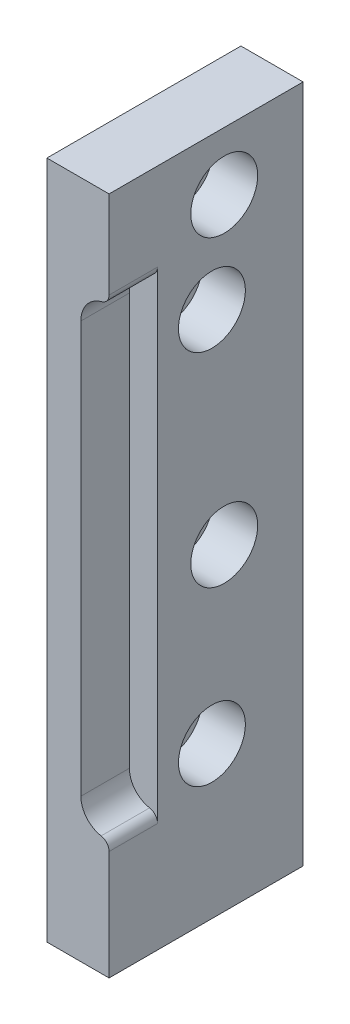
ISO-10303-21;
HEADER;
FILE_DESCRIPTION(('STEP AP214'),'2;1');
FILE_NAME('part.step','',(''),(''),'','','');
FILE_SCHEMA(('AUTOMOTIVE_DESIGN { 1 0 10303 214 1 1 1 1 }'));
ENDSEC;
DATA;
#1=APPLICATION_CONTEXT('core data for automotive mechanical design processes');
#2=APPLICATION_PROTOCOL_DEFINITION('international standard','automotive_design',2000,#1);
#3=PRODUCT_CONTEXT('',#1,'mechanical');
#4=PRODUCT('Part','Part','',(#3));
#5=PRODUCT_RELATED_PRODUCT_CATEGORY('part','',(#4));
#6=PRODUCT_DEFINITION_FORMATION('','',#4);
#7=PRODUCT_DEFINITION_CONTEXT('part definition',#1,'design');
#8=PRODUCT_DEFINITION('design','',#6,#7);
#9=PRODUCT_DEFINITION_SHAPE('','',#8);
#10=(LENGTH_UNIT() NAMED_UNIT(*) SI_UNIT(.MILLI.,.METRE.));
#11=(NAMED_UNIT(*) PLANE_ANGLE_UNIT() SI_UNIT($,.RADIAN.));
#12=(NAMED_UNIT(*) SI_UNIT($,.STERADIAN.) SOLID_ANGLE_UNIT());
#13=UNCERTAINTY_MEASURE_WITH_UNIT(LENGTH_MEASURE(1.E-05),#10,'distance_accuracy_value','');
#14=(GEOMETRIC_REPRESENTATION_CONTEXT(3) GLOBAL_UNCERTAINTY_ASSIGNED_CONTEXT((#13)) GLOBAL_UNIT_ASSIGNED_CONTEXT((#10,
#11,#12)) REPRESENTATION_CONTEXT('',''));
#15=CARTESIAN_POINT('',(0.,0.,0.));
#16=DIRECTION('',(0.,0.,1.));
#17=DIRECTION('',(1.,0.,0.));
#18=AXIS2_PLACEMENT_3D('',#15,#16,#17);
#19=CARTESIAN_POINT('',(-8.1407,73.66,-4.7498));
#20=DIRECTION('',(1.,0.,0.));
#21=DIRECTION('',(0.,0.,-1.));
#22=AXIS2_PLACEMENT_3D('',#19,#20,#21);
#23=CYLINDRICAL_SURFACE('',#22,5.715);
#24=CARTESIAN_POINT('',(-8.1407,73.66,-4.7498));
#25=DIRECTION('',(1.,0.,0.));
#26=DIRECTION('',(0.,0.,-1.));
#27=AXIS2_PLACEMENT_3D('',#24,#25,#26);
#28=CIRCLE('',#27,5.715);
#29=CARTESIAN_POINT('',(-8.1407,73.66,-10.4648));
#30=VERTEX_POINT('',#29);
#31=EDGE_CURVE('E183',#30,#30,#28,.T.);
#32=ORIENTED_EDGE('',*,*,#31,.F.);
#33=EDGE_LOOP('',(#32));
#34=FACE_BOUND('',#33,.T.);
#35=CARTESIAN_POINT('',(-3.5433,73.66,-4.7498));
#36=DIRECTION('',(1.,0.,0.));
#37=DIRECTION('',(0.,0.,-1.));
#38=AXIS2_PLACEMENT_3D('',#35,#36,#37);
#39=CIRCLE('',#38,5.715);
#40=CARTESIAN_POINT('',(-3.5433,73.66,-10.4648));
#41=VERTEX_POINT('',#40);
#42=EDGE_CURVE('E278',#41,#41,#39,.F.);
#43=ORIENTED_EDGE('',*,*,#42,.F.);
#44=EDGE_LOOP('',(#43));
#45=FACE_BOUND('',#44,.T.);
#46=ADVANCED_FACE('F50',(#34,#45),#23,.F.);
#47=CARTESIAN_POINT('',(-8.1407,-5.71500000000003,-4.7498));
#48=DIRECTION('',(1.,0.,0.));
#49=DIRECTION('',(0.,0.,-1.));
#50=AXIS2_PLACEMENT_3D('',#47,#48,#49);
#51=CYLINDRICAL_SURFACE('',#50,5.715);
#52=CARTESIAN_POINT('',(-8.1407,-5.71500000000003,-4.7498));
#53=DIRECTION('',(1.,0.,0.));
#54=DIRECTION('',(0.,0.,-1.));
#55=AXIS2_PLACEMENT_3D('',#52,#53,#54);
#56=CIRCLE('',#55,5.715);
#57=CARTESIAN_POINT('',(-8.1407,-5.71500000000003,-10.4648));
#58=VERTEX_POINT('',#57);
#59=EDGE_CURVE('E333',#58,#58,#56,.T.);
#60=ORIENTED_EDGE('',*,*,#59,.F.);
#61=EDGE_LOOP('',(#60));
#62=FACE_BOUND('',#61,.T.);
#63=CARTESIAN_POINT('',(-3.5433,-5.71500000000003,-4.7498));
#64=DIRECTION('',(1.,0.,0.));
#65=DIRECTION('',(0.,0.,-1.));
#66=AXIS2_PLACEMENT_3D('',#63,#64,#65);
#67=CIRCLE('',#66,5.715);
#68=CARTESIAN_POINT('',(-3.5433,-5.71500000000003,-10.4648));
#69=VERTEX_POINT('',#68);
#70=EDGE_CURVE('E274',#69,#69,#67,.F.);
#71=ORIENTED_EDGE('',*,*,#70,.F.);
#72=EDGE_LOOP('',(#71));
#73=FACE_BOUND('',#72,.T.);
#74=ADVANCED_FACE('F385',(#62,#73),#51,.F.);
#75=CARTESIAN_POINT('',(-8.1407,-49.211738,-1.524));
#76=DIRECTION('',(1.,0.,0.));
#77=DIRECTION('',(0.,0.,-1.));
#78=AXIS2_PLACEMENT_3D('',#75,#76,#77);
#79=CYLINDRICAL_SURFACE('',#78,6.75767);
#80=CARTESIAN_POINT('',(-8.1407,-49.211738,-1.524));
#81=DIRECTION('',(1.,0.,0.));
#82=DIRECTION('',(0.,0.,-1.));
#83=AXIS2_PLACEMENT_3D('',#80,#81,#82);
#84=CIRCLE('',#83,6.75767);
#85=CARTESIAN_POINT('',(-8.1407,-49.211738,-8.28167));
#86=VERTEX_POINT('',#85);
#87=EDGE_CURVE('E220',#86,#86,#84,.T.);
#88=ORIENTED_EDGE('',*,*,#87,.F.);
#89=EDGE_LOOP('',(#88));
#90=FACE_BOUND('',#89,.T.);
#91=CARTESIAN_POINT('',(-3.1877,-49.211738,-1.524));
#92=DIRECTION('',(1.,0.,0.));
#93=DIRECTION('',(0.,0.,-1.));
#94=AXIS2_PLACEMENT_3D('',#91,#92,#93);
#95=CIRCLE('',#94,6.75767);
#96=CARTESIAN_POINT('',(-3.1877,-49.211738,-8.28167));
#97=VERTEX_POINT('',#96);
#98=EDGE_CURVE('E224',#97,#97,#95,.F.);
#99=ORIENTED_EDGE('',*,*,#98,.F.);
#100=EDGE_LOOP('',(#99));
#101=FACE_BOUND('',#100,.T.);
#102=ADVANCED_FACE('F391',(#90,#101),#79,.F.);
#103=CARTESIAN_POINT('',(-8.1407,49.211738,-1.524));
#104=DIRECTION('',(1.,0.,0.));
#105=DIRECTION('',(0.,0.,-1.));
#106=AXIS2_PLACEMENT_3D('',#103,#104,#105);
#107=CYLINDRICAL_SURFACE('',#106,6.75767);
#108=CARTESIAN_POINT('',(-8.1407,49.211738,-1.524));
#109=DIRECTION('',(1.,0.,0.));
#110=DIRECTION('',(0.,0.,-1.));
#111=AXIS2_PLACEMENT_3D('',#108,#109,#110);
#112=CIRCLE('',#111,6.75767);
#113=CARTESIAN_POINT('',(-8.1407,49.211738,-8.28167));
#114=VERTEX_POINT('',#113);
#115=EDGE_CURVE('E215',#114,#114,#112,.T.);
#116=ORIENTED_EDGE('',*,*,#115,.F.);
#117=EDGE_LOOP('',(#116));
#118=FACE_BOUND('',#117,.T.);
#119=CARTESIAN_POINT('',(-3.1877,49.211738,-1.524));
#120=DIRECTION('',(1.,0.,0.));
#121=DIRECTION('',(0.,0.,-1.));
#122=AXIS2_PLACEMENT_3D('',#119,#120,#121);
#123=CIRCLE('',#122,6.75767);
#124=CARTESIAN_POINT('',(-3.1877,49.211738,-8.28167));
#125=VERTEX_POINT('',#124);
#126=EDGE_CURVE('E208',#125,#125,#123,.F.);
#127=ORIENTED_EDGE('',*,*,#126,.F.);
#128=EDGE_LOOP('',(#127));
#129=FACE_BOUND('',#128,.T.);
#130=ADVANCED_FACE('F362',(#118,#129),#107,.F.);
#131=CARTESIAN_POINT('',(8.1407,88.9,25.4));
#132=DIRECTION('',(-1.,0.,0.));
#133=DIRECTION('',(0.,0.,1.));
#134=AXIS2_PLACEMENT_3D('',#131,#132,#133);
#135=PLANE('',#134);
#136=CARTESIAN_POINT('',(8.1407,-5.71500000000003,-4.7498));
#137=DIRECTION('',(1.,0.,0.));
#138=DIRECTION('',(0.,0.,-1.));
#139=AXIS2_PLACEMENT_3D('',#136,#137,#138);
#140=CIRCLE('',#139,8.763);
#141=CARTESIAN_POINT('',(8.1407,-5.71500000000003,-13.5128));
#142=VERTEX_POINT('',#141);
#143=EDGE_CURVE('E346',#142,#142,#140,.T.);
#144=ORIENTED_EDGE('',*,*,#143,.F.);
#145=EDGE_LOOP('',(#144));
#146=FACE_BOUND('',#145,.T.);
#147=CARTESIAN_POINT('',(8.1407,73.66,-4.7498));
#148=DIRECTION('',(1.,0.,0.));
#149=DIRECTION('',(0.,0.,-1.));
#150=AXIS2_PLACEMENT_3D('',#147,#148,#149);
#151=CIRCLE('',#150,8.763);
#152=CARTESIAN_POINT('',(8.1407,73.66,-13.5128));
#153=VERTEX_POINT('',#152);
#154=EDGE_CURVE('E347',#153,#153,#151,.T.);
#155=ORIENTED_EDGE('',*,*,#154,.F.);
#156=EDGE_LOOP('',(#155));
#157=FACE_BOUND('',#156,.T.);
#158=CARTESIAN_POINT('',(8.1407,49.211738,-1.524));
#159=DIRECTION('',(1.,0.,0.));
#160=DIRECTION('',(0.,0.,-1.));
#161=AXIS2_PLACEMENT_3D('',#158,#159,#160);
#162=CIRCLE('',#161,8.7641176);
#163=CARTESIAN_POINT('',(8.1407,49.211738,-10.2881176));
#164=VERTEX_POINT('',#163);
#165=EDGE_CURVE('E199',#164,#164,#162,.T.);
#166=ORIENTED_EDGE('',*,*,#165,.F.);
#167=EDGE_LOOP('',(#166));
#168=FACE_BOUND('',#167,.T.);
#169=CARTESIAN_POINT('',(8.1407,-49.211738,-1.524));
#170=DIRECTION('',(1.,0.,0.));
#171=DIRECTION('',(0.,0.,-1.));
#172=AXIS2_PLACEMENT_3D('',#169,#170,#171);
#173=CIRCLE('',#172,8.7641176);
#174=CARTESIAN_POINT('',(8.1407,-49.211738,-10.2881176));
#175=VERTEX_POINT('',#174);
#176=EDGE_CURVE('E197',#175,#175,#173,.T.);
#177=ORIENTED_EDGE('',*,*,#176,.F.);
#178=EDGE_LOOP('',(#177));
#179=FACE_BOUND('',#178,.T.);
#180=DIRECTION('',(0.,1.,0.));
#181=VECTOR('',#180,1.);
#182=CARTESIAN_POINT('',(8.1407,88.9,25.4));
#183=LINE('',#182,#181);
#184=CARTESIAN_POINT('',(8.1407,65.9690425037124,25.4));
#185=VERTEX_POINT('',#184);
#186=CARTESIAN_POINT('',(8.1407,88.9,25.4));
#187=VERTEX_POINT('',#186);
#188=EDGE_CURVE('E230',#185,#187,#183,.T.);
#189=ORIENTED_EDGE('',*,*,#188,.F.);
#190=DIRECTION('',(0.,0.,1.));
#191=VECTOR('',#190,1.);
#192=CARTESIAN_POINT('',(8.1407,65.9690425037124,25.4));
#193=LINE('',#192,#191);
#194=CARTESIAN_POINT('',(8.1407,65.9690425037124,12.7));
#195=VERTEX_POINT('',#194);
#196=EDGE_CURVE('E296',#185,#195,#193,.F.);
#197=ORIENTED_EDGE('',*,*,#196,.T.);
#198=DIRECTION('',(0.,1.,0.));
#199=VECTOR('',#198,1.);
#200=CARTESIAN_POINT('',(8.1407,63.7555589049376,12.7));
#201=LINE('',#200,#199);
#202=CARTESIAN_POINT('',(8.1407,-60.2191752106717,12.7));
#203=VERTEX_POINT('',#202);
#204=EDGE_CURVE('E73',#203,#195,#201,.T.);
#205=ORIENTED_EDGE('',*,*,#204,.F.);
#206=DIRECTION('',(0.,0.,1.));
#207=VECTOR('',#206,1.);
#208=CARTESIAN_POINT('',(8.1407,-60.2191752106717,25.4));
#209=LINE('',#208,#207);
#210=CARTESIAN_POINT('',(8.1407,-60.2191752106717,25.4));
#211=VERTEX_POINT('',#210);
#212=EDGE_CURVE('E291',#203,#211,#209,.T.);
#213=ORIENTED_EDGE('',*,*,#212,.T.);
#214=CARTESIAN_POINT('',(8.1407,-88.9,25.4));
#215=VERTEX_POINT('',#214);
#216=EDGE_CURVE('E225',#215,#211,#183,.T.);
#217=ORIENTED_EDGE('',*,*,#216,.F.);
#218=DIRECTION('',(0.,0.,-1.));
#219=VECTOR('',#218,1.);
#220=CARTESIAN_POINT('',(8.1407,-88.9,25.4));
#221=LINE('',#220,#219);
#222=CARTESIAN_POINT('',(8.1407,-88.9,-25.4));
#223=VERTEX_POINT('',#222);
#224=EDGE_CURVE('E239',#215,#223,#221,.T.);
#225=ORIENTED_EDGE('',*,*,#224,.T.);
#226=DIRECTION('',(0.,1.,0.));
#227=VECTOR('',#226,1.);
#228=CARTESIAN_POINT('',(8.1407,88.9,-25.4));
#229=LINE('',#228,#227);
#230=CARTESIAN_POINT('',(8.1407,88.9,-25.4));
#231=VERTEX_POINT('',#230);
#232=EDGE_CURVE('E219',#223,#231,#229,.T.);
#233=ORIENTED_EDGE('',*,*,#232,.T.);
#234=DIRECTION('',(0.,0.,-1.));
#235=VECTOR('',#234,1.);
#236=CARTESIAN_POINT('',(8.1407,88.9,25.4));
#237=LINE('',#236,#235);
#238=EDGE_CURVE('E263',#187,#231,#237,.T.);
#239=ORIENTED_EDGE('',*,*,#238,.F.);
#240=EDGE_LOOP('',(#189,#197,#205,#213,#217,#225,#233,#239));
#241=FACE_BOUND('',#240,.T.);
#242=ADVANCED_FACE('F313',(#146,#157,#168,#179,#241),#135,.F.);
#243=CARTESIAN_POINT('',(8.1407,88.9,25.4));
#244=DIRECTION('',(0.,-1.,0.));
#245=DIRECTION('',(1.,0.,0.));
#246=AXIS2_PLACEMENT_3D('',#243,#244,#245);
#247=PLANE('',#246);
#248=DIRECTION('',(-1.,0.,0.));
#249=VECTOR('',#248,1.);
#250=CARTESIAN_POINT('',(8.1407,88.9,-25.4));
#251=LINE('',#250,#249);
#252=CARTESIAN_POINT('',(-8.1407,88.9,-25.4));
#253=VERTEX_POINT('',#252);
#254=EDGE_CURVE('E243',#231,#253,#251,.T.);
#255=ORIENTED_EDGE('',*,*,#254,.T.);
#256=DIRECTION('',(0.,0.,-1.));
#257=VECTOR('',#256,1.);
#258=CARTESIAN_POINT('',(-8.1407,88.9,25.4));
#259=LINE('',#258,#257);
#260=CARTESIAN_POINT('',(-8.1407,88.9,25.4));
#261=VERTEX_POINT('',#260);
#262=EDGE_CURVE('E259',#261,#253,#259,.T.);
#263=ORIENTED_EDGE('',*,*,#262,.F.);
#264=DIRECTION('',(-1.,0.,0.));
#265=VECTOR('',#264,1.);
#266=CARTESIAN_POINT('',(8.1407,88.9,25.4));
#267=LINE('',#266,#265);
#268=EDGE_CURVE('E229',#187,#261,#267,.T.);
#269=ORIENTED_EDGE('',*,*,#268,.F.);
#270=ORIENTED_EDGE('',*,*,#238,.T.);
#271=EDGE_LOOP('',(#255,#263,#269,#270));
#272=FACE_BOUND('',#271,.T.);
#273=ADVANCED_FACE('F311',(#272),#247,.F.);
#274=CARTESIAN_POINT('',(-8.1407,88.9,25.4));
#275=DIRECTION('',(1.,0.,0.));
#276=DIRECTION('',(0.,0.,-1.));
#277=AXIS2_PLACEMENT_3D('',#274,#275,#276);
#278=PLANE('',#277);
#279=ORIENTED_EDGE('',*,*,#59,.T.);
#280=EDGE_LOOP('',(#279));
#281=FACE_BOUND('',#280,.T.);
#282=ORIENTED_EDGE('',*,*,#31,.T.);
#283=EDGE_LOOP('',(#282));
#284=FACE_BOUND('',#283,.T.);
#285=ORIENTED_EDGE('',*,*,#115,.T.);
#286=EDGE_LOOP('',(#285));
#287=FACE_BOUND('',#286,.T.);
#288=ORIENTED_EDGE('',*,*,#87,.T.);
#289=EDGE_LOOP('',(#288));
#290=FACE_BOUND('',#289,.T.);
#291=DIRECTION('',(0.,-1.,0.));
#292=VECTOR('',#291,1.);
#293=CARTESIAN_POINT('',(-8.1407,88.9,-25.4));
#294=LINE('',#293,#292);
#295=CARTESIAN_POINT('',(-8.1407,-88.9,-25.4));
#296=VERTEX_POINT('',#295);
#297=EDGE_CURVE('E246',#253,#296,#294,.T.);
#298=ORIENTED_EDGE('',*,*,#297,.T.);
#299=DIRECTION('',(0.,0.,-1.));
#300=VECTOR('',#299,1.);
#301=CARTESIAN_POINT('',(-8.1407,-88.9,25.4));
#302=LINE('',#301,#300);
#303=CARTESIAN_POINT('',(-8.1407,-88.9,25.4));
#304=VERTEX_POINT('',#303);
#305=EDGE_CURVE('E255',#304,#296,#302,.T.);
#306=ORIENTED_EDGE('',*,*,#305,.F.);
#307=DIRECTION('',(0.,-1.,0.));
#308=VECTOR('',#307,1.);
#309=CARTESIAN_POINT('',(-8.1407,88.9,25.4));
#310=LINE('',#309,#308);
#311=EDGE_CURVE('E233',#261,#304,#310,.T.);
#312=ORIENTED_EDGE('',*,*,#311,.F.);
#313=ORIENTED_EDGE('',*,*,#262,.T.);
#314=EDGE_LOOP('',(#298,#306,#312,#313));
#315=FACE_BOUND('',#314,.T.);
#316=ADVANCED_FACE('F322',(#281,#284,#287,#290,#315),#278,.F.);
#317=CARTESIAN_POINT('',(-8.1407,-88.9,25.4));
#318=DIRECTION('',(0.,1.,0.));
#319=DIRECTION('',(-1.,0.,0.));
#320=AXIS2_PLACEMENT_3D('',#317,#318,#319);
#321=PLANE('',#320);
#322=DIRECTION('',(1.,0.,0.));
#323=VECTOR('',#322,1.);
#324=CARTESIAN_POINT('',(-8.1407,-88.9,-25.4));
#325=LINE('',#324,#323);
#326=EDGE_CURVE('E249',#296,#223,#325,.T.);
#327=ORIENTED_EDGE('',*,*,#326,.T.);
#328=ORIENTED_EDGE('',*,*,#224,.F.);
#329=DIRECTION('',(1.,0.,0.));
#330=VECTOR('',#329,1.);
#331=CARTESIAN_POINT('',(-8.1407,-88.9,25.4));
#332=LINE('',#331,#330);
#333=EDGE_CURVE('E236',#304,#215,#332,.T.);
#334=ORIENTED_EDGE('',*,*,#333,.F.);
#335=ORIENTED_EDGE('',*,*,#305,.T.);
#336=EDGE_LOOP('',(#327,#328,#334,#335));
#337=FACE_BOUND('',#336,.T.);
#338=ADVANCED_FACE('F326',(#337),#321,.F.);
#339=CARTESIAN_POINT('',(0.,0.,25.4));
#340=DIRECTION('',(0.,0.,1.));
#341=DIRECTION('',(1.,0.,0.));
#342=AXIS2_PLACEMENT_3D('',#339,#340,#341);
#343=PLANE('',#342);
#344=CARTESIAN_POINT('',(8.12429999999964,56.3805771395363,25.4));
#345=DIRECTION('',(0.,0.,1.));
#346=DIRECTION('',(1.,0.,0.));
#347=AXIS2_PLACEMENT_3D('',#344,#345,#346);
#348=CIRCLE('',#347,7.3750000000002);
#349=CARTESIAN_POINT('',(6.2471895612707,63.5126933332629,25.4));
#350=VERTEX_POINT('',#349);
#351=CARTESIAN_POINT('',(0.749299999999443,56.3805771395362,25.4));
#352=VERTEX_POINT('',#351);
#353=EDGE_CURVE('E143',#350,#352,#348,.T.);
#354=ORIENTED_EDGE('',*,*,#353,.F.);
#355=CARTESIAN_POINT('',(5.6007,65.9690425037124,25.4));
#356=DIRECTION('',(0.,0.,1.));
#357=DIRECTION('',(1.,0.,0.));
#358=AXIS2_PLACEMENT_3D('',#355,#356,#357);
#359=CIRCLE('',#358,2.54);
#360=EDGE_CURVE('E288',#350,#185,#359,.T.);
#361=ORIENTED_EDGE('',*,*,#360,.T.);
#362=ORIENTED_EDGE('',*,*,#188,.T.);
#363=ORIENTED_EDGE('',*,*,#268,.T.);
#364=ORIENTED_EDGE('',*,*,#311,.T.);
#365=ORIENTED_EDGE('',*,*,#333,.T.);
#366=ORIENTED_EDGE('',*,*,#216,.T.);
#367=CARTESIAN_POINT('',(5.6007,-60.2191752106717,25.4));
#368=DIRECTION('',(0.,0.,1.));
#369=DIRECTION('',(1.,0.,0.));
#370=AXIS2_PLACEMENT_3D('',#367,#368,#369);
#371=CIRCLE('',#370,2.54);
#372=CARTESIAN_POINT('',(6.04978062234787,-57.7191898917885,25.4));
#373=VERTEX_POINT('',#372);
#374=EDGE_CURVE('E285',#211,#373,#371,.T.);
#375=ORIENTED_EDGE('',*,*,#374,.T.);
#376=CARTESIAN_POINT('',(7.18819999999976,-51.3817271084193,25.4));
#377=DIRECTION('',(0.,0.,1.));
#378=DIRECTION('',(1.,0.,0.));
#379=AXIS2_PLACEMENT_3D('',#376,#377,#378);
#380=CIRCLE('',#379,6.43890000000023);
#381=CARTESIAN_POINT('',(0.749299999999528,-51.3817271084193,25.4));
#382=VERTEX_POINT('',#381);
#383=EDGE_CURVE('E157',#382,#373,#380,.T.);
#384=ORIENTED_EDGE('',*,*,#383,.F.);
#385=DIRECTION('',(0.,-1.,0.));
#386=VECTOR('',#385,1.);
#387=CARTESIAN_POINT('',(0.749299999999528,-51.3817271084193,25.4));
#388=LINE('',#387,#386);
#389=EDGE_CURVE('E182',#352,#382,#388,.T.);
#390=ORIENTED_EDGE('',*,*,#389,.F.);
#391=EDGE_LOOP('',(#354,#361,#362,#363,#364,#365,#366,#375,#384,#390));
#392=FACE_BOUND('',#391,.T.);
#393=ADVANCED_FACE('F305',(#392),#343,.T.);
#394=CARTESIAN_POINT('',(0.,0.,-25.4));
#395=DIRECTION('',(0.,0.,1.));
#396=DIRECTION('',(1.,0.,0.));
#397=AXIS2_PLACEMENT_3D('',#394,#395,#396);
#398=PLANE('',#397);
#399=ORIENTED_EDGE('',*,*,#232,.F.);
#400=ORIENTED_EDGE('',*,*,#326,.F.);
#401=ORIENTED_EDGE('',*,*,#297,.F.);
#402=ORIENTED_EDGE('',*,*,#254,.F.);
#403=EDGE_LOOP('',(#399,#400,#401,#402));
#404=FACE_BOUND('',#403,.T.);
#405=ADVANCED_FACE('F319',(#404),#398,.F.);
#406=CARTESIAN_POINT('',(-3.1877,88.9,25.4));
#407=DIRECTION('',(1.,0.,0.));
#408=DIRECTION('',(0.,0.,-1.));
#409=AXIS2_PLACEMENT_3D('',#406,#407,#408);
#410=PLANE('',#409);
#411=CARTESIAN_POINT('',(-3.1877,49.211738,-1.524));
#412=DIRECTION('',(1.,0.,0.));
#413=DIRECTION('',(0.,0.,-1.));
#414=AXIS2_PLACEMENT_3D('',#411,#412,#413);
#415=CIRCLE('',#414,8.7641176);
#416=CARTESIAN_POINT('',(-3.1877,49.211738,-10.2881176));
#417=VERTEX_POINT('',#416);
#418=EDGE_CURVE('E203',#417,#417,#415,.F.);
#419=ORIENTED_EDGE('',*,*,#418,.F.);
#420=EDGE_LOOP('',(#419));
#421=FACE_BOUND('',#420,.T.);
#422=ORIENTED_EDGE('',*,*,#126,.T.);
#423=EDGE_LOOP('',(#422));
#424=FACE_BOUND('',#423,.T.);
#425=ADVANCED_FACE('F405',(#421,#424),#410,.T.);
#426=CARTESIAN_POINT('',(-32.9293679443055,49.211738,-1.524));
#427=DIRECTION('',(1.,0.,0.));
#428=DIRECTION('',(0.,0.,-1.));
#429=AXIS2_PLACEMENT_3D('',#426,#427,#428);
#430=CYLINDRICAL_SURFACE('',#429,8.7641176);
#431=ORIENTED_EDGE('',*,*,#418,.T.);
#432=EDGE_LOOP('',(#431));
#433=FACE_BOUND('',#432,.T.);
#434=ORIENTED_EDGE('',*,*,#165,.T.);
#435=EDGE_LOOP('',(#434));
#436=FACE_BOUND('',#435,.T.);
#437=ADVANCED_FACE('F380',(#433,#436),#430,.F.);
#438=CARTESIAN_POINT('',(-3.1877,88.9,25.4));
#439=DIRECTION('',(1.,0.,0.));
#440=DIRECTION('',(0.,0.,-1.));
#441=AXIS2_PLACEMENT_3D('',#438,#439,#440);
#442=PLANE('',#441);
#443=CARTESIAN_POINT('',(-3.1877,-49.211738,-1.524));
#444=DIRECTION('',(1.,0.,0.));
#445=DIRECTION('',(0.,0.,-1.));
#446=AXIS2_PLACEMENT_3D('',#443,#444,#445);
#447=CIRCLE('',#446,8.7641176);
#448=CARTESIAN_POINT('',(-3.1877,-49.211738,-10.2881176));
#449=VERTEX_POINT('',#448);
#450=EDGE_CURVE('E204',#449,#449,#447,.F.);
#451=ORIENTED_EDGE('',*,*,#450,.F.);
#452=EDGE_LOOP('',(#451));
#453=FACE_BOUND('',#452,.T.);
#454=ORIENTED_EDGE('',*,*,#98,.T.);
#455=EDGE_LOOP('',(#454));
#456=FACE_BOUND('',#455,.T.);
#457=ADVANCED_FACE('F372',(#453,#456),#442,.T.);
#458=CARTESIAN_POINT('',(-32.9293679443055,-49.211738,-1.524));
#459=DIRECTION('',(1.,0.,0.));
#460=DIRECTION('',(0.,0.,-1.));
#461=AXIS2_PLACEMENT_3D('',#458,#459,#460);
#462=CYLINDRICAL_SURFACE('',#461,8.7641176);
#463=ORIENTED_EDGE('',*,*,#450,.T.);
#464=EDGE_LOOP('',(#463));
#465=FACE_BOUND('',#464,.T.);
#466=ORIENTED_EDGE('',*,*,#176,.T.);
#467=EDGE_LOOP('',(#466));
#468=FACE_BOUND('',#467,.T.);
#469=ADVANCED_FACE('F370',(#465,#468),#462,.F.);
#470=CARTESIAN_POINT('',(7.18819999999976,-51.3817271084193,12.7));
#471=DIRECTION('',(0.,0.,1.));
#472=DIRECTION('',(1.,0.,0.));
#473=AXIS2_PLACEMENT_3D('',#470,#471,#472);
#474=CYLINDRICAL_SURFACE('',#473,6.43890000000023);
#475=ORIENTED_EDGE('',*,*,#383,.T.);
#476=DIRECTION('',(0.,0.,1.));
#477=VECTOR('',#476,1.);
#478=CARTESIAN_POINT('',(6.04978062234787,-57.7191898917885,12.7));
#479=LINE('',#478,#477);
#480=CARTESIAN_POINT('',(6.04978062234787,-57.7191898917885,12.7));
#481=VERTEX_POINT('',#480);
#482=EDGE_CURVE('E66',#373,#481,#479,.F.);
#483=ORIENTED_EDGE('',*,*,#482,.T.);
#484=CARTESIAN_POINT('',(7.18819999999976,-51.3817271084193,12.7));
#485=DIRECTION('',(0.,0.,1.));
#486=DIRECTION('',(1.,0.,0.));
#487=AXIS2_PLACEMENT_3D('',#484,#485,#486);
#488=CIRCLE('',#487,6.43890000000023);
#489=CARTESIAN_POINT('',(0.749299999999528,-51.3817271084193,12.7));
#490=VERTEX_POINT('',#489);
#491=EDGE_CURVE('E178',#490,#481,#488,.T.);
#492=ORIENTED_EDGE('',*,*,#491,.F.);
#493=DIRECTION('',(0.,0.,1.));
#494=VECTOR('',#493,1.);
#495=CARTESIAN_POINT('',(0.749299999999528,-51.3817271084193,12.7));
#496=LINE('',#495,#494);
#497=EDGE_CURVE('E148',#490,#382,#496,.T.);
#498=ORIENTED_EDGE('',*,*,#497,.T.);
#499=EDGE_LOOP('',(#475,#483,#492,#498));
#500=FACE_BOUND('',#499,.T.);
#501=ADVANCED_FACE('F331',(#500),#474,.F.);
#502=CARTESIAN_POINT('',(0.749299999999528,-51.3817271084193,12.7));
#503=DIRECTION('',(-1.,0.,0.));
#504=DIRECTION('',(0.,-1.,0.));
#505=AXIS2_PLACEMENT_3D('',#502,#503,#504);
#506=PLANE('',#505);
#507=ORIENTED_EDGE('',*,*,#389,.T.);
#508=ORIENTED_EDGE('',*,*,#497,.F.);
#509=DIRECTION('',(0.,-1.,0.));
#510=VECTOR('',#509,1.);
#511=CARTESIAN_POINT('',(0.749299999999528,-51.3817271084193,12.7));
#512=LINE('',#511,#510);
#513=CARTESIAN_POINT('',(0.749299999999443,56.3805771395362,12.7));
#514=VERTEX_POINT('',#513);
#515=EDGE_CURVE('E132',#514,#490,#512,.T.);
#516=ORIENTED_EDGE('',*,*,#515,.F.);
#517=DIRECTION('',(0.,0.,1.));
#518=VECTOR('',#517,1.);
#519=CARTESIAN_POINT('',(0.749299999999443,56.3805771395362,12.7));
#520=LINE('',#519,#518);
#521=EDGE_CURVE('E140',#514,#352,#520,.T.);
#522=ORIENTED_EDGE('',*,*,#521,.T.);
#523=EDGE_LOOP('',(#507,#508,#516,#522));
#524=FACE_BOUND('',#523,.T.);
#525=ADVANCED_FACE('F150',(#524),#506,.F.);
#526=CARTESIAN_POINT('',(8.12429999999964,56.3805771395363,12.7));
#527=DIRECTION('',(0.,0.,1.));
#528=DIRECTION('',(1.,0.,0.));
#529=AXIS2_PLACEMENT_3D('',#526,#527,#528);
#530=CYLINDRICAL_SURFACE('',#529,7.3750000000002);
#531=CARTESIAN_POINT('',(8.12429999999964,56.3805771395363,12.7));
#532=DIRECTION('',(0.,0.,1.));
#533=DIRECTION('',(1.,0.,0.));
#534=AXIS2_PLACEMENT_3D('',#531,#532,#533);
#535=CIRCLE('',#534,7.3750000000002);
#536=CARTESIAN_POINT('',(6.2471895612707,63.5126933332629,12.7));
#537=VERTEX_POINT('',#536);
#538=EDGE_CURVE('E128',#537,#514,#535,.T.);
#539=ORIENTED_EDGE('',*,*,#538,.F.);
#540=DIRECTION('',(0.,0.,1.));
#541=VECTOR('',#540,1.);
#542=CARTESIAN_POINT('',(6.2471895612707,63.5126933332629,12.7));
#543=LINE('',#542,#541);
#544=EDGE_CURVE('E267',#537,#350,#543,.T.);
#545=ORIENTED_EDGE('',*,*,#544,.T.);
#546=ORIENTED_EDGE('',*,*,#353,.T.);
#547=ORIENTED_EDGE('',*,*,#521,.F.);
#548=EDGE_LOOP('',(#539,#545,#546,#547));
#549=FACE_BOUND('',#548,.T.);
#550=ADVANCED_FACE('F141',(#549),#530,.F.);
#551=CARTESIAN_POINT('',(7.18819999999976,-51.3817271084193,12.7));
#552=DIRECTION('',(0.,0.,1.));
#553=DIRECTION('',(1.,0.,0.));
#554=AXIS2_PLACEMENT_3D('',#551,#552,#553);
#555=PLANE('',#554);
#556=ORIENTED_EDGE('',*,*,#491,.T.);
#557=CARTESIAN_POINT('',(5.6007,-60.2191752106717,12.7));
#558=DIRECTION('',(0.,0.,1.));
#559=DIRECTION('',(1.,0.,0.));
#560=AXIS2_PLACEMENT_3D('',#557,#558,#559);
#561=CIRCLE('',#560,2.54);
#562=EDGE_CURVE('E13',#481,#203,#561,.F.);
#563=ORIENTED_EDGE('',*,*,#562,.T.);
#564=ORIENTED_EDGE('',*,*,#204,.T.);
#565=CARTESIAN_POINT('',(5.6007,65.9690425037124,12.7));
#566=DIRECTION('',(0.,0.,1.));
#567=DIRECTION('',(1.,0.,0.));
#568=AXIS2_PLACEMENT_3D('',#565,#566,#567);
#569=CIRCLE('',#568,2.54);
#570=EDGE_CURVE('E59',#195,#537,#569,.F.);
#571=ORIENTED_EDGE('',*,*,#570,.T.);
#572=ORIENTED_EDGE('',*,*,#538,.T.);
#573=ORIENTED_EDGE('',*,*,#515,.T.);
#574=EDGE_LOOP('',(#556,#563,#564,#571,#572,#573));
#575=FACE_BOUND('',#574,.T.);
#576=ADVANCED_FACE('F130',(#575),#555,.T.);
#577=CARTESIAN_POINT('',(-3.5433,88.9,25.4));
#578=DIRECTION('',(1.,0.,0.));
#579=DIRECTION('',(0.,0.,-1.));
#580=AXIS2_PLACEMENT_3D('',#577,#578,#579);
#581=PLANE('',#580);
#582=CARTESIAN_POINT('',(-3.5433,-5.71500000000003,-4.7498));
#583=DIRECTION('',(1.,0.,0.));
#584=DIRECTION('',(0.,0.,-1.));
#585=AXIS2_PLACEMENT_3D('',#582,#583,#584);
#586=CIRCLE('',#585,8.763);
#587=CARTESIAN_POINT('',(-3.5433,-5.71500000000003,-13.5128));
#588=VERTEX_POINT('',#587);
#589=EDGE_CURVE('E279',#588,#588,#586,.F.);
#590=ORIENTED_EDGE('',*,*,#589,.F.);
#591=EDGE_LOOP('',(#590));
#592=FACE_BOUND('',#591,.T.);
#593=ORIENTED_EDGE('',*,*,#70,.T.);
#594=EDGE_LOOP('',(#593));
#595=FACE_BOUND('',#594,.T.);
#596=ADVANCED_FACE('F400',(#592,#595),#581,.T.);
#597=CARTESIAN_POINT('',(-32.9262068941509,-5.71500000000003,-4.7498));
#598=DIRECTION('',(1.,0.,0.));
#599=DIRECTION('',(0.,0.,-1.));
#600=AXIS2_PLACEMENT_3D('',#597,#598,#599);
#601=CYLINDRICAL_SURFACE('',#600,8.763);
#602=ORIENTED_EDGE('',*,*,#589,.T.);
#603=EDGE_LOOP('',(#602));
#604=FACE_BOUND('',#603,.T.);
#605=ORIENTED_EDGE('',*,*,#143,.T.);
#606=EDGE_LOOP('',(#605));
#607=FACE_BOUND('',#606,.T.);
#608=ADVANCED_FACE('F358',(#604,#607),#601,.F.);
#609=CARTESIAN_POINT('',(-3.5433,88.9,25.4));
#610=DIRECTION('',(1.,0.,0.));
#611=DIRECTION('',(0.,0.,-1.));
#612=AXIS2_PLACEMENT_3D('',#609,#610,#611);
#613=PLANE('',#612);
#614=CARTESIAN_POINT('',(-3.5433,73.66,-4.7498));
#615=DIRECTION('',(1.,0.,0.));
#616=DIRECTION('',(0.,0.,-1.));
#617=AXIS2_PLACEMENT_3D('',#614,#615,#616);
#618=CIRCLE('',#617,8.763);
#619=CARTESIAN_POINT('',(-3.5433,73.66,-13.5128));
#620=VERTEX_POINT('',#619);
#621=EDGE_CURVE('E342',#620,#620,#618,.F.);
#622=ORIENTED_EDGE('',*,*,#621,.F.);
#623=EDGE_LOOP('',(#622));
#624=FACE_BOUND('',#623,.T.);
#625=ORIENTED_EDGE('',*,*,#42,.T.);
#626=EDGE_LOOP('',(#625));
#627=FACE_BOUND('',#626,.T.);
#628=ADVANCED_FACE('F444',(#624,#627),#613,.T.);
#629=CARTESIAN_POINT('',(-32.9262068941509,73.66,-4.7498));
#630=DIRECTION('',(1.,0.,0.));
#631=DIRECTION('',(0.,0.,-1.));
#632=AXIS2_PLACEMENT_3D('',#629,#630,#631);
#633=CYLINDRICAL_SURFACE('',#632,8.763);
#634=ORIENTED_EDGE('',*,*,#621,.T.);
#635=EDGE_LOOP('',(#634));
#636=FACE_BOUND('',#635,.T.);
#637=ORIENTED_EDGE('',*,*,#154,.T.);
#638=EDGE_LOOP('',(#637));
#639=FACE_BOUND('',#638,.T.);
#640=ADVANCED_FACE('F438',(#636,#639),#633,.F.);
#641=CARTESIAN_POINT('',(5.6007,65.9690425037124,12.7));
#642=DIRECTION('',(0.,0.,1.));
#643=DIRECTION('',(1.,0.,0.));
#644=AXIS2_PLACEMENT_3D('',#641,#642,#643);
#645=CYLINDRICAL_SURFACE('',#644,2.54);
#646=ORIENTED_EDGE('',*,*,#570,.F.);
#647=ORIENTED_EDGE('',*,*,#196,.F.);
#648=ORIENTED_EDGE('',*,*,#360,.F.);
#649=ORIENTED_EDGE('',*,*,#544,.F.);
#650=EDGE_LOOP('',(#646,#647,#648,#649));
#651=FACE_BOUND('',#650,.T.);
#652=ADVANCED_FACE('F436',(#651),#645,.T.);
#653=CARTESIAN_POINT('',(5.6007,-60.2191752106717,12.7));
#654=DIRECTION('',(0.,0.,1.));
#655=DIRECTION('',(1.,0.,0.));
#656=AXIS2_PLACEMENT_3D('',#653,#654,#655);
#657=CYLINDRICAL_SURFACE('',#656,2.54);
#658=ORIENTED_EDGE('',*,*,#562,.F.);
#659=ORIENTED_EDGE('',*,*,#482,.F.);
#660=ORIENTED_EDGE('',*,*,#374,.F.);
#661=ORIENTED_EDGE('',*,*,#212,.F.);
#662=EDGE_LOOP('',(#658,#659,#660,#661));
#663=FACE_BOUND('',#662,.T.);
#664=ADVANCED_FACE('F52',(#663),#657,.T.);
#665=CLOSED_SHELL('',(#46,#74,#102,#130,#242,#273,#316,#338,#393,#405,#425,#437,#457,#469,#501,
#525,#550,#576,#596,#608,#628,#640,#652,#664));
#666=MANIFOLD_SOLID_BREP('B2',#665);
#667=ADVANCED_BREP_SHAPE_REPRESENTATION('',(#18,#666),#14);
#668=SHAPE_DEFINITION_REPRESENTATION(#9,#667);
ENDSEC;
END-ISO-10303-21;
